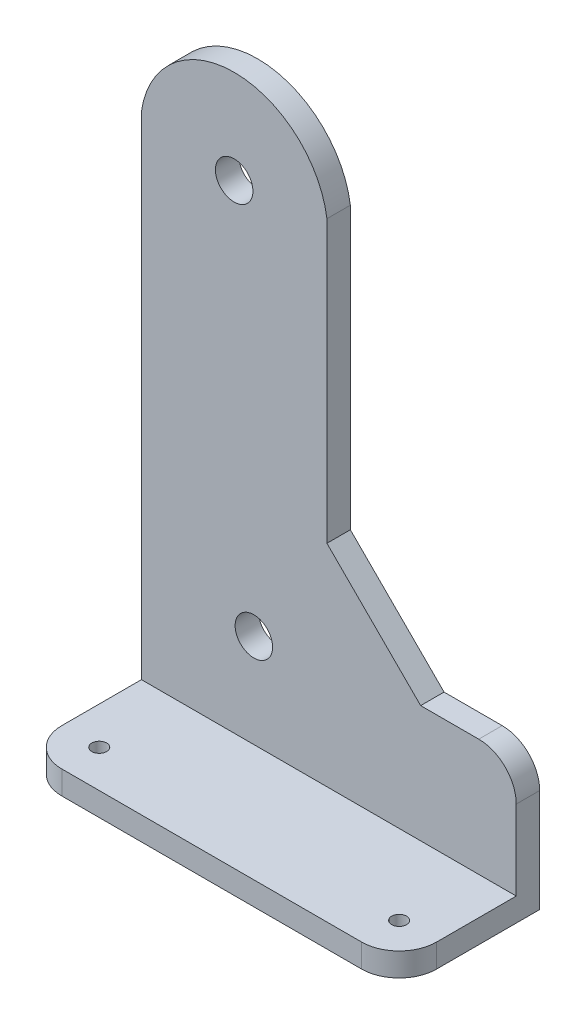
ISO-10303-21;
HEADER;
FILE_DESCRIPTION(('STEP AP214'),'2;1');
FILE_NAME('part.step','',(''),(''),'','','');
FILE_SCHEMA(('AUTOMOTIVE_DESIGN { 1 0 10303 214 1 1 1 1 }'));
ENDSEC;
DATA;
#1=APPLICATION_CONTEXT('core data for automotive mechanical design processes');
#2=APPLICATION_PROTOCOL_DEFINITION('international standard','automotive_design',2000,#1);
#3=PRODUCT_CONTEXT('',#1,'mechanical');
#4=PRODUCT('Part','Part','',(#3));
#5=PRODUCT_RELATED_PRODUCT_CATEGORY('part','',(#4));
#6=PRODUCT_DEFINITION_FORMATION('','',#4);
#7=PRODUCT_DEFINITION_CONTEXT('part definition',#1,'design');
#8=PRODUCT_DEFINITION('design','',#6,#7);
#9=PRODUCT_DEFINITION_SHAPE('','',#8);
#10=(LENGTH_UNIT() NAMED_UNIT(*) SI_UNIT(.MILLI.,.METRE.));
#11=(NAMED_UNIT(*) PLANE_ANGLE_UNIT() SI_UNIT($,.RADIAN.));
#12=(NAMED_UNIT(*) SI_UNIT($,.STERADIAN.) SOLID_ANGLE_UNIT());
#13=UNCERTAINTY_MEASURE_WITH_UNIT(LENGTH_MEASURE(1.E-05),#10,'distance_accuracy_value','');
#14=(GEOMETRIC_REPRESENTATION_CONTEXT(3) GLOBAL_UNCERTAINTY_ASSIGNED_CONTEXT((#13)) GLOBAL_UNIT_ASSIGNED_CONTEXT((#10,
#11,#12)) REPRESENTATION_CONTEXT('',''));
#15=CARTESIAN_POINT('',(0.,0.,0.));
#16=DIRECTION('',(0.,0.,1.));
#17=DIRECTION('',(1.,0.,0.));
#18=AXIS2_PLACEMENT_3D('',#15,#16,#17);
#19=CARTESIAN_POINT('',(-61.550518812335,-258.970259643485,25.));
#20=DIRECTION('',(1.,0.,0.));
#21=DIRECTION('',(0.,1.,0.));
#22=AXIS2_PLACEMENT_3D('',#19,#20,#21);
#23=PLANE('',#22);
#24=DIRECTION('',(0.,1.,0.));
#25=VECTOR('',#24,1.);
#26=CARTESIAN_POINT('',(-61.550518812335,-383.970259643485,110.));
#27=LINE('',#26,#25);
#28=CARTESIAN_POINT('',(-61.550518812335,-258.970259643485,110.));
#29=VERTEX_POINT('',#28);
#30=CARTESIAN_POINT('',(-61.550518812335,-233.970259643485,110.));
#31=VERTEX_POINT('',#30);
#32=EDGE_CURVE('E236',#29,#31,#27,.T.);
#33=ORIENTED_EDGE('',*,*,#32,.T.);
#34=DIRECTION('',(0.,0.,-1.));
#35=VECTOR('',#34,1.);
#36=CARTESIAN_POINT('',(-61.550518812335,-233.970259643485,150.));
#37=LINE('',#36,#35);
#38=CARTESIAN_POINT('',(-61.550518812335,-233.970259643485,25.));
#39=VERTEX_POINT('',#38);
#40=EDGE_CURVE('E149',#31,#39,#37,.T.);
#41=ORIENTED_EDGE('',*,*,#40,.T.);
#42=DIRECTION('',(0.,-1.,0.));
#43=VECTOR('',#42,1.);
#44=CARTESIAN_POINT('',(-61.550518812335,-258.970259643485,25.));
#45=LINE('',#44,#43);
#46=CARTESIAN_POINT('',(-61.550518812335,291.029740356515,25.));
#47=VERTEX_POINT('',#46);
#48=EDGE_CURVE('E168',#47,#39,#45,.T.);
#49=ORIENTED_EDGE('',*,*,#48,.F.);
#50=DIRECTION('',(0.,0.,-1.));
#51=VECTOR('',#50,1.);
#52=CARTESIAN_POINT('',(-61.550518812335,291.029740356515,25.));
#53=LINE('',#52,#51);
#54=CARTESIAN_POINT('',(-61.550518812335,291.029740356515,0.));
#55=VERTEX_POINT('',#54);
#56=EDGE_CURVE('E196',#47,#55,#53,.T.);
#57=ORIENTED_EDGE('',*,*,#56,.T.);
#58=DIRECTION('',(0.,-1.,0.));
#59=VECTOR('',#58,1.);
#60=CARTESIAN_POINT('',(-61.550518812335,-258.970259643485,0.));
#61=LINE('',#60,#59);
#62=CARTESIAN_POINT('',(-61.550518812335,-258.970259643485,0.));
#63=VERTEX_POINT('',#62);
#64=EDGE_CURVE('E183',#55,#63,#61,.T.);
#65=ORIENTED_EDGE('',*,*,#64,.T.);
#66=DIRECTION('',(0.,0.,-1.));
#67=VECTOR('',#66,1.);
#68=CARTESIAN_POINT('',(-61.550518812335,-258.970259643485,25.));
#69=LINE('',#68,#67);
#70=EDGE_CURVE('E194',#29,#63,#69,.T.);
#71=ORIENTED_EDGE('',*,*,#70,.F.);
#72=EDGE_LOOP('',(#33,#41,#49,#57,#65,#71));
#73=FACE_BOUND('',#72,.T.);
#74=ADVANCED_FACE('F37',(#73),#23,.F.);
#75=CARTESIAN_POINT('',(0.,0.,150.));
#76=DIRECTION('',(0.,0.,-1.));
#77=DIRECTION('',(-1.,0.,0.));
#78=AXIS2_PLACEMENT_3D('',#75,#76,#77);
#79=PLANE('',#78);
#80=DIRECTION('',(0.,1.,0.));
#81=VECTOR('',#80,1.);
#82=CARTESIAN_POINT('',(298.449481187665,-383.970259643485,150.));
#83=LINE('',#82,#81);
#84=CARTESIAN_POINT('',(298.449481187665,-233.970259643485,150.));
#85=VERTEX_POINT('',#84);
#86=CARTESIAN_POINT('',(298.449481187665,-258.970259643485,150.));
#87=VERTEX_POINT('',#86);
#88=EDGE_CURVE('E11',#85,#87,#83,.F.);
#89=ORIENTED_EDGE('',*,*,#88,.F.);
#90=DIRECTION('',(-1.,0.,0.));
#91=VECTOR('',#90,1.);
#92=CARTESIAN_POINT('',(-61.550518812335,-233.970259643485,150.));
#93=LINE('',#92,#91);
#94=CARTESIAN_POINT('',(-21.5505188123348,-233.970259643485,150.));
#95=VERTEX_POINT('',#94);
#96=EDGE_CURVE('E141',#85,#95,#93,.T.);
#97=ORIENTED_EDGE('',*,*,#96,.T.);
#98=DIRECTION('',(0.,1.,0.));
#99=VECTOR('',#98,1.);
#100=CARTESIAN_POINT('',(-21.550518812335,-383.970259643485,150.));
#101=LINE('',#100,#99);
#102=CARTESIAN_POINT('',(-21.550518812335,-258.970259643485,150.));
#103=VERTEX_POINT('',#102);
#104=EDGE_CURVE('E46',#95,#103,#101,.F.);
#105=ORIENTED_EDGE('',*,*,#104,.T.);
#106=DIRECTION('',(1.,0.,0.));
#107=VECTOR('',#106,1.);
#108=CARTESIAN_POINT('',(-61.550518812335,-258.970259643485,150.));
#109=LINE('',#108,#107);
#110=EDGE_CURVE('E243',#103,#87,#109,.T.);
#111=ORIENTED_EDGE('',*,*,#110,.T.);
#112=EDGE_LOOP('',(#89,#97,#105,#111));
#113=FACE_BOUND('',#112,.T.);
#114=ADVANCED_FACE('F246',(#113),#79,.F.);
#115=CARTESIAN_POINT('',(298.449481187665,-148.970259643485,25.));
#116=DIRECTION('',(0.,0.,1.));
#117=DIRECTION('',(1.,0.,0.));
#118=AXIS2_PLACEMENT_3D('',#115,#116,#117);
#119=PLANE('',#118);
#120=CARTESIAN_POINT('',(58.449481187665,-133.970259643485,25.));
#121=DIRECTION('',(0.,0.,1.));
#122=DIRECTION('',(1.,0.,0.));
#123=AXIS2_PLACEMENT_3D('',#120,#121,#122);
#124=CIRCLE('',#123,20.);
#125=CARTESIAN_POINT('',(78.449481187665,-133.970259643485,25.));
#126=VERTEX_POINT('',#125);
#127=EDGE_CURVE('E213',#126,#126,#124,.T.);
#128=ORIENTED_EDGE('',*,*,#127,.F.);
#129=EDGE_LOOP('',(#128));
#130=FACE_BOUND('',#129,.T.);
#131=CARTESIAN_POINT('',(37.4392760433285,276.851570007924,25.));
#132=DIRECTION('',(0.,0.,1.));
#133=DIRECTION('',(1.,0.,0.));
#134=AXIS2_PLACEMENT_3D('',#131,#132,#133);
#135=CIRCLE('',#134,20.);
#136=CARTESIAN_POINT('',(57.4392760433285,276.851570007924,25.));
#137=VERTEX_POINT('',#136);
#138=EDGE_CURVE('E219',#137,#137,#135,.T.);
#139=ORIENTED_EDGE('',*,*,#138,.F.);
#140=EDGE_LOOP('',(#139));
#141=FACE_BOUND('',#140,.T.);
#142=ORIENTED_EDGE('',*,*,#48,.T.);
#143=DIRECTION('',(1.,0.,0.));
#144=VECTOR('',#143,1.);
#145=CARTESIAN_POINT('',(298.449481187665,-233.970259643485,25.));
#146=LINE('',#145,#144);
#147=CARTESIAN_POINT('',(338.449481187665,-233.970259643485,25.));
#148=VERTEX_POINT('',#147);
#149=EDGE_CURVE('E148',#39,#148,#146,.T.);
#150=ORIENTED_EDGE('',*,*,#149,.T.);
#151=DIRECTION('',(0.,1.,0.));
#152=VECTOR('',#151,1.);
#153=CARTESIAN_POINT('',(338.449481187665,-258.970259643485,25.));
#154=LINE('',#153,#152);
#155=CARTESIAN_POINT('',(338.449481187665,-148.970259643485,25.));
#156=VERTEX_POINT('',#155);
#157=EDGE_CURVE('E147',#148,#156,#154,.T.);
#158=ORIENTED_EDGE('',*,*,#157,.T.);
#159=CARTESIAN_POINT('',(298.449481187665,-148.970259643485,25.));
#160=DIRECTION('',(0.,0.,1.));
#161=DIRECTION('',(1.,0.,0.));
#162=AXIS2_PLACEMENT_3D('',#159,#160,#161);
#163=CIRCLE('',#162,40.);
#164=CARTESIAN_POINT('',(298.449481187665,-108.970259643485,25.));
#165=VERTEX_POINT('',#164);
#166=EDGE_CURVE('E156',#156,#165,#163,.T.);
#167=ORIENTED_EDGE('',*,*,#166,.T.);
#168=DIRECTION('',(-1.,0.,0.));
#169=VECTOR('',#168,1.);
#170=CARTESIAN_POINT('',(298.449481187665,-108.970259643485,25.));
#171=LINE('',#170,#169);
#172=CARTESIAN_POINT('',(236.429070898992,-108.970259643485,25.));
#173=VERTEX_POINT('',#172);
#174=EDGE_CURVE('E159',#165,#173,#171,.T.);
#175=ORIENTED_EDGE('',*,*,#174,.T.);
#176=DIRECTION('',(-0.707106781186546,0.707106781186549,0.));
#177=VECTOR('',#176,1.);
#178=CARTESIAN_POINT('',(236.429070898992,-108.970259643485,25.));
#179=LINE('',#178,#177);
#180=CARTESIAN_POINT('',(136.429070898992,-8.97025964348497,25.));
#181=VERTEX_POINT('',#180);
#182=EDGE_CURVE('E162',#173,#181,#179,.T.);
#183=ORIENTED_EDGE('',*,*,#182,.T.);
#184=DIRECTION('',(0.,1.,0.));
#185=VECTOR('',#184,1.);
#186=CARTESIAN_POINT('',(136.429070898992,-8.97025964348497,25.));
#187=LINE('',#186,#185);
#188=CARTESIAN_POINT('',(136.429070898992,291.029740356515,25.));
#189=VERTEX_POINT('',#188);
#190=EDGE_CURVE('E164',#181,#189,#187,.T.);
#191=ORIENTED_EDGE('',*,*,#190,.T.);
#192=CARTESIAN_POINT('',(37.4392760433285,276.851570007924,25.));
#193=DIRECTION('',(0.,0.,1.));
#194=DIRECTION('',(-1.,0.,0.));
#195=AXIS2_PLACEMENT_3D('',#192,#193,#194);
#196=CIRCLE('',#195,100.);
#197=EDGE_CURVE('E166',#189,#47,#196,.T.);
#198=ORIENTED_EDGE('',*,*,#197,.T.);
#199=EDGE_LOOP('',(#142,#150,#158,#167,#175,#183,#191,#198));
#200=FACE_BOUND('',#199,.T.);
#201=ADVANCED_FACE('F265',(#130,#141,#200),#119,.T.);
#202=CARTESIAN_POINT('',(298.449481187665,-148.970259643485,25.));
#203=DIRECTION('',(0.,0.,-1.));
#204=DIRECTION('',(-1.,0.,0.));
#205=AXIS2_PLACEMENT_3D('',#202,#203,#204);
#206=CYLINDRICAL_SURFACE('',#205,40.);
#207=CARTESIAN_POINT('',(298.449481187665,-148.970259643485,0.));
#208=DIRECTION('',(0.,0.,1.));
#209=DIRECTION('',(1.,0.,0.));
#210=AXIS2_PLACEMENT_3D('',#207,#208,#209);
#211=CIRCLE('',#210,40.);
#212=CARTESIAN_POINT('',(338.449481187665,-148.970259643485,0.));
#213=VERTEX_POINT('',#212);
#214=CARTESIAN_POINT('',(298.449481187665,-108.970259643485,0.));
#215=VERTEX_POINT('',#214);
#216=EDGE_CURVE('E151',#213,#215,#211,.T.);
#217=ORIENTED_EDGE('',*,*,#216,.T.);
#218=DIRECTION('',(0.,0.,-1.));
#219=VECTOR('',#218,1.);
#220=CARTESIAN_POINT('',(298.449481187665,-108.970259643485,25.));
#221=LINE('',#220,#219);
#222=EDGE_CURVE('E208',#165,#215,#221,.T.);
#223=ORIENTED_EDGE('',*,*,#222,.F.);
#224=ORIENTED_EDGE('',*,*,#166,.F.);
#225=DIRECTION('',(0.,0.,-1.));
#226=VECTOR('',#225,1.);
#227=CARTESIAN_POINT('',(338.449481187665,-148.970259643485,25.));
#228=LINE('',#227,#226);
#229=EDGE_CURVE('E172',#156,#213,#228,.T.);
#230=ORIENTED_EDGE('',*,*,#229,.T.);
#231=EDGE_LOOP('',(#217,#223,#224,#230));
#232=FACE_BOUND('',#231,.T.);
#233=ADVANCED_FACE('F39',(#232),#206,.T.);
#234=CARTESIAN_POINT('',(298.449481187665,-108.970259643485,25.));
#235=DIRECTION('',(0.,-1.,0.));
#236=DIRECTION('',(0.,0.,-1.));
#237=AXIS2_PLACEMENT_3D('',#234,#235,#236);
#238=PLANE('',#237);
#239=DIRECTION('',(-1.,0.,0.));
#240=VECTOR('',#239,1.);
#241=CARTESIAN_POINT('',(298.449481187665,-108.970259643485,0.));
#242=LINE('',#241,#240);
#243=CARTESIAN_POINT('',(236.429070898992,-108.970259643485,0.));
#244=VERTEX_POINT('',#243);
#245=EDGE_CURVE('E175',#215,#244,#242,.T.);
#246=ORIENTED_EDGE('',*,*,#245,.T.);
#247=DIRECTION('',(0.,0.,-1.));
#248=VECTOR('',#247,1.);
#249=CARTESIAN_POINT('',(236.429070898992,-108.970259643485,25.));
#250=LINE('',#249,#248);
#251=EDGE_CURVE('E205',#173,#244,#250,.T.);
#252=ORIENTED_EDGE('',*,*,#251,.F.);
#253=ORIENTED_EDGE('',*,*,#174,.F.);
#254=ORIENTED_EDGE('',*,*,#222,.T.);
#255=EDGE_LOOP('',(#246,#252,#253,#254));
#256=FACE_BOUND('',#255,.T.);
#257=ADVANCED_FACE('F262',(#256),#238,.F.);
#258=CARTESIAN_POINT('',(236.429070898992,-108.970259643485,25.));
#259=DIRECTION('',(-0.707106781186549,-0.707106781186546,0.));
#260=DIRECTION('',(0.707106781186546,-0.707106781186549,0.));
#261=AXIS2_PLACEMENT_3D('',#258,#259,#260);
#262=PLANE('',#261);
#263=DIRECTION('',(-0.707106781186546,0.707106781186549,0.));
#264=VECTOR('',#263,1.);
#265=CARTESIAN_POINT('',(236.429070898992,-108.970259643485,0.));
#266=LINE('',#265,#264);
#267=CARTESIAN_POINT('',(136.429070898992,-8.97025964348497,0.));
#268=VERTEX_POINT('',#267);
#269=EDGE_CURVE('E177',#244,#268,#266,.T.);
#270=ORIENTED_EDGE('',*,*,#269,.T.);
#271=DIRECTION('',(0.,0.,-1.));
#272=VECTOR('',#271,1.);
#273=CARTESIAN_POINT('',(136.429070898992,-8.97025964348497,25.));
#274=LINE('',#273,#272);
#275=EDGE_CURVE('E202',#181,#268,#274,.T.);
#276=ORIENTED_EDGE('',*,*,#275,.F.);
#277=ORIENTED_EDGE('',*,*,#182,.F.);
#278=ORIENTED_EDGE('',*,*,#251,.T.);
#279=EDGE_LOOP('',(#270,#276,#277,#278));
#280=FACE_BOUND('',#279,.T.);
#281=ADVANCED_FACE('F283',(#280),#262,.F.);
#282=CARTESIAN_POINT('',(136.429070898992,-8.97025964348497,25.));
#283=DIRECTION('',(-1.,0.,0.));
#284=DIRECTION('',(0.,0.,1.));
#285=AXIS2_PLACEMENT_3D('',#282,#283,#284);
#286=PLANE('',#285);
#287=DIRECTION('',(0.,1.,0.));
#288=VECTOR('',#287,1.);
#289=CARTESIAN_POINT('',(136.429070898992,-8.97025964348497,0.));
#290=LINE('',#289,#288);
#291=CARTESIAN_POINT('',(136.429070898992,291.029740356515,0.));
#292=VERTEX_POINT('',#291);
#293=EDGE_CURVE('E179',#268,#292,#290,.T.);
#294=ORIENTED_EDGE('',*,*,#293,.T.);
#295=DIRECTION('',(0.,0.,-1.));
#296=VECTOR('',#295,1.);
#297=CARTESIAN_POINT('',(136.429070898992,291.029740356515,25.));
#298=LINE('',#297,#296);
#299=EDGE_CURVE('E199',#189,#292,#298,.T.);
#300=ORIENTED_EDGE('',*,*,#299,.F.);
#301=ORIENTED_EDGE('',*,*,#190,.F.);
#302=ORIENTED_EDGE('',*,*,#275,.T.);
#303=EDGE_LOOP('',(#294,#300,#301,#302));
#304=FACE_BOUND('',#303,.T.);
#305=ADVANCED_FACE('F280',(#304),#286,.F.);
#306=CARTESIAN_POINT('',(37.4392760433285,276.851570007924,25.));
#307=DIRECTION('',(0.,0.,-1.));
#308=DIRECTION('',(-1.,0.,0.));
#309=AXIS2_PLACEMENT_3D('',#306,#307,#308);
#310=CYLINDRICAL_SURFACE('',#309,100.);
#311=CARTESIAN_POINT('',(37.4392760433285,276.851570007924,0.));
#312=DIRECTION('',(0.,0.,1.));
#313=DIRECTION('',(-1.,0.,0.));
#314=AXIS2_PLACEMENT_3D('',#311,#312,#313);
#315=CIRCLE('',#314,100.);
#316=EDGE_CURVE('E181',#292,#55,#315,.T.);
#317=ORIENTED_EDGE('',*,*,#316,.T.);
#318=ORIENTED_EDGE('',*,*,#56,.F.);
#319=ORIENTED_EDGE('',*,*,#197,.F.);
#320=ORIENTED_EDGE('',*,*,#299,.T.);
#321=EDGE_LOOP('',(#317,#318,#319,#320));
#322=FACE_BOUND('',#321,.T.);
#323=ADVANCED_FACE('F275',(#322),#310,.T.);
#324=CARTESIAN_POINT('',(-61.550518812335,-258.970259643485,25.));
#325=DIRECTION('',(0.,1.,0.));
#326=DIRECTION('',(0.,0.,1.));
#327=AXIS2_PLACEMENT_3D('',#324,#325,#326);
#328=PLANE('',#327);
#329=CARTESIAN_POINT('',(-21.550518812335,-258.970259643485,110.));
#330=DIRECTION('',(0.,1.,0.));
#331=DIRECTION('',(0.,0.,1.));
#332=AXIS2_PLACEMENT_3D('',#329,#330,#331);
#333=CIRCLE('',#332,7.94);
#334=CARTESIAN_POINT('',(-21.550518812335,-258.970259643485,117.94));
#335=VERTEX_POINT('',#334);
#336=EDGE_CURVE('E234',#335,#335,#333,.T.);
#337=ORIENTED_EDGE('',*,*,#336,.T.);
#338=EDGE_LOOP('',(#337));
#339=FACE_BOUND('',#338,.T.);
#340=CARTESIAN_POINT('',(298.449481187665,-258.970259643485,110.));
#341=DIRECTION('',(0.,1.,0.));
#342=DIRECTION('',(0.,0.,1.));
#343=AXIS2_PLACEMENT_3D('',#340,#341,#342);
#344=CIRCLE('',#343,7.93999999999998);
#345=CARTESIAN_POINT('',(298.449481187665,-258.970259643485,117.94));
#346=VERTEX_POINT('',#345);
#347=EDGE_CURVE('E229',#346,#346,#344,.T.);
#348=ORIENTED_EDGE('',*,*,#347,.T.);
#349=EDGE_LOOP('',(#348));
#350=FACE_BOUND('',#349,.T.);
#351=DIRECTION('',(0.,0.,-1.));
#352=VECTOR('',#351,1.);
#353=CARTESIAN_POINT('',(338.449481187665,-258.970259643485,25.));
#354=LINE('',#353,#352);
#355=CARTESIAN_POINT('',(338.449481187665,-258.970259643485,110.));
#356=VERTEX_POINT('',#355);
#357=CARTESIAN_POINT('',(338.449481187665,-258.970259643485,0.));
#358=VERTEX_POINT('',#357);
#359=EDGE_CURVE('E192',#356,#358,#354,.T.);
#360=ORIENTED_EDGE('',*,*,#359,.F.);
#361=CARTESIAN_POINT('',(298.449481187665,-258.970259643485,110.));
#362=DIRECTION('',(0.,1.,0.));
#363=DIRECTION('',(0.,0.,1.));
#364=AXIS2_PLACEMENT_3D('',#361,#362,#363);
#365=CIRCLE('',#364,40.);
#366=EDGE_CURVE('E128',#356,#87,#365,.F.);
#367=ORIENTED_EDGE('',*,*,#366,.T.);
#368=ORIENTED_EDGE('',*,*,#110,.F.);
#369=CARTESIAN_POINT('',(-21.550518812335,-258.970259643485,110.));
#370=DIRECTION('',(0.,1.,0.));
#371=DIRECTION('',(0.,0.,1.));
#372=AXIS2_PLACEMENT_3D('',#369,#370,#371);
#373=CIRCLE('',#372,40.);
#374=EDGE_CURVE('E61',#103,#29,#373,.F.);
#375=ORIENTED_EDGE('',*,*,#374,.T.);
#376=ORIENTED_EDGE('',*,*,#70,.T.);
#377=DIRECTION('',(1.,0.,0.));
#378=VECTOR('',#377,1.);
#379=CARTESIAN_POINT('',(-61.550518812335,-258.970259643485,0.));
#380=LINE('',#379,#378);
#381=EDGE_CURVE('E186',#63,#358,#380,.T.);
#382=ORIENTED_EDGE('',*,*,#381,.T.);
#383=EDGE_LOOP('',(#360,#367,#368,#375,#376,#382));
#384=FACE_BOUND('',#383,.T.);
#385=ADVANCED_FACE('F249',(#339,#350,#384),#328,.F.);
#386=CARTESIAN_POINT('',(338.449481187665,-258.970259643485,25.));
#387=DIRECTION('',(-1.,0.,0.));
#388=DIRECTION('',(0.,-1.,0.));
#389=AXIS2_PLACEMENT_3D('',#386,#387,#388);
#390=PLANE('',#389);
#391=DIRECTION('',(0.,0.,-1.));
#392=VECTOR('',#391,1.);
#393=CARTESIAN_POINT('',(338.449481187665,-233.970259643485,150.));
#394=LINE('',#393,#392);
#395=CARTESIAN_POINT('',(338.449481187665,-233.970259643485,110.));
#396=VERTEX_POINT('',#395);
#397=EDGE_CURVE('E137',#396,#148,#394,.T.);
#398=ORIENTED_EDGE('',*,*,#397,.F.);
#399=DIRECTION('',(0.,1.,0.));
#400=VECTOR('',#399,1.);
#401=CARTESIAN_POINT('',(338.449481187665,-383.970259643485,110.));
#402=LINE('',#401,#400);
#403=EDGE_CURVE('E125',#356,#396,#402,.T.);
#404=ORIENTED_EDGE('',*,*,#403,.F.);
#405=ORIENTED_EDGE('',*,*,#359,.T.);
#406=DIRECTION('',(0.,1.,0.));
#407=VECTOR('',#406,1.);
#408=CARTESIAN_POINT('',(338.449481187665,-258.970259643485,0.));
#409=LINE('',#408,#407);
#410=EDGE_CURVE('E160',#358,#213,#409,.T.);
#411=ORIENTED_EDGE('',*,*,#410,.T.);
#412=ORIENTED_EDGE('',*,*,#229,.F.);
#413=ORIENTED_EDGE('',*,*,#157,.F.);
#414=EDGE_LOOP('',(#398,#404,#405,#411,#412,#413));
#415=FACE_BOUND('',#414,.T.);
#416=ADVANCED_FACE('F145',(#415),#390,.F.);
#417=CARTESIAN_POINT('',(298.449481187665,-148.970259643485,0.));
#418=DIRECTION('',(0.,0.,1.));
#419=DIRECTION('',(1.,0.,0.));
#420=AXIS2_PLACEMENT_3D('',#417,#418,#419);
#421=PLANE('',#420);
#422=CARTESIAN_POINT('',(58.449481187665,-133.970259643485,0.));
#423=DIRECTION('',(0.,0.,1.));
#424=DIRECTION('',(1.,0.,0.));
#425=AXIS2_PLACEMENT_3D('',#422,#423,#424);
#426=CIRCLE('',#425,20.);
#427=CARTESIAN_POINT('',(78.449481187665,-133.970259643485,0.));
#428=VERTEX_POINT('',#427);
#429=EDGE_CURVE('E41',#428,#428,#426,.T.);
#430=ORIENTED_EDGE('',*,*,#429,.T.);
#431=EDGE_LOOP('',(#430));
#432=FACE_BOUND('',#431,.T.);
#433=CARTESIAN_POINT('',(37.4392760433285,276.851570007924,0.));
#434=DIRECTION('',(0.,0.,1.));
#435=DIRECTION('',(1.,0.,0.));
#436=AXIS2_PLACEMENT_3D('',#433,#434,#435);
#437=CIRCLE('',#436,20.);
#438=CARTESIAN_POINT('',(57.4392760433285,276.851570007924,0.));
#439=VERTEX_POINT('',#438);
#440=EDGE_CURVE('E211',#439,#439,#437,.T.);
#441=ORIENTED_EDGE('',*,*,#440,.T.);
#442=EDGE_LOOP('',(#441));
#443=FACE_BOUND('',#442,.T.);
#444=ORIENTED_EDGE('',*,*,#381,.F.);
#445=ORIENTED_EDGE('',*,*,#64,.F.);
#446=ORIENTED_EDGE('',*,*,#316,.F.);
#447=ORIENTED_EDGE('',*,*,#293,.F.);
#448=ORIENTED_EDGE('',*,*,#269,.F.);
#449=ORIENTED_EDGE('',*,*,#245,.F.);
#450=ORIENTED_EDGE('',*,*,#216,.F.);
#451=ORIENTED_EDGE('',*,*,#410,.F.);
#452=EDGE_LOOP('',(#444,#445,#446,#447,#448,#449,#450,#451));
#453=FACE_BOUND('',#452,.T.);
#454=ADVANCED_FACE('F257',(#432,#443,#453),#421,.F.);
#455=CARTESIAN_POINT('',(-61.550518812335,-233.970259643485,150.));
#456=DIRECTION('',(0.,-1.,0.));
#457=DIRECTION('',(0.,0.,-1.));
#458=AXIS2_PLACEMENT_3D('',#455,#456,#457);
#459=PLANE('',#458);
#460=CARTESIAN_POINT('',(-21.550518812335,-233.970259643485,110.));
#461=DIRECTION('',(0.,1.,0.));
#462=DIRECTION('',(0.,0.,1.));
#463=AXIS2_PLACEMENT_3D('',#460,#461,#462);
#464=CIRCLE('',#463,7.94);
#465=CARTESIAN_POINT('',(-21.550518812335,-233.970259643485,117.94));
#466=VERTEX_POINT('',#465);
#467=EDGE_CURVE('E226',#466,#466,#464,.T.);
#468=ORIENTED_EDGE('',*,*,#467,.F.);
#469=EDGE_LOOP('',(#468));
#470=FACE_BOUND('',#469,.T.);
#471=CARTESIAN_POINT('',(298.449481187665,-233.970259643485,110.));
#472=DIRECTION('',(0.,1.,0.));
#473=DIRECTION('',(0.,0.,1.));
#474=AXIS2_PLACEMENT_3D('',#471,#472,#473);
#475=CIRCLE('',#474,7.93999999999998);
#476=CARTESIAN_POINT('',(298.449481187665,-233.970259643485,117.94));
#477=VERTEX_POINT('',#476);
#478=EDGE_CURVE('E217',#477,#477,#475,.T.);
#479=ORIENTED_EDGE('',*,*,#478,.F.);
#480=EDGE_LOOP('',(#479));
#481=FACE_BOUND('',#480,.T.);
#482=ORIENTED_EDGE('',*,*,#96,.F.);
#483=CARTESIAN_POINT('',(298.449481187665,-233.970259643485,110.));
#484=DIRECTION('',(0.,-1.,0.));
#485=DIRECTION('',(0.,0.,-1.));
#486=AXIS2_PLACEMENT_3D('',#483,#484,#485);
#487=CIRCLE('',#486,40.);
#488=EDGE_CURVE('E53',#396,#85,#487,.T.);
#489=ORIENTED_EDGE('',*,*,#488,.F.);
#490=ORIENTED_EDGE('',*,*,#397,.T.);
#491=ORIENTED_EDGE('',*,*,#149,.F.);
#492=ORIENTED_EDGE('',*,*,#40,.F.);
#493=CARTESIAN_POINT('',(-21.550518812335,-233.970259643485,110.));
#494=DIRECTION('',(0.,-1.,0.));
#495=DIRECTION('',(0.,0.,1.));
#496=AXIS2_PLACEMENT_3D('',#493,#494,#495);
#497=CIRCLE('',#496,40.);
#498=EDGE_CURVE('E142',#95,#31,#497,.T.);
#499=ORIENTED_EDGE('',*,*,#498,.F.);
#500=EDGE_LOOP('',(#482,#489,#490,#491,#492,#499));
#501=FACE_BOUND('',#500,.T.);
#502=ADVANCED_FACE('F135',(#470,#481,#501),#459,.F.);
#503=CARTESIAN_POINT('',(-21.550518812335,-383.970259643485,110.));
#504=DIRECTION('',(0.,1.,0.));
#505=DIRECTION('',(0.,0.,1.));
#506=AXIS2_PLACEMENT_3D('',#503,#504,#505);
#507=CYLINDRICAL_SURFACE('',#506,40.);
#508=ORIENTED_EDGE('',*,*,#104,.F.);
#509=ORIENTED_EDGE('',*,*,#498,.T.);
#510=ORIENTED_EDGE('',*,*,#32,.F.);
#511=ORIENTED_EDGE('',*,*,#374,.F.);
#512=EDGE_LOOP('',(#508,#509,#510,#511));
#513=FACE_BOUND('',#512,.T.);
#514=ADVANCED_FACE('F270',(#513),#507,.T.);
#515=CARTESIAN_POINT('',(298.449481187665,-383.970259643485,110.));
#516=DIRECTION('',(0.,1.,0.));
#517=DIRECTION('',(0.,0.,1.));
#518=AXIS2_PLACEMENT_3D('',#515,#516,#517);
#519=CYLINDRICAL_SURFACE('',#518,40.);
#520=ORIENTED_EDGE('',*,*,#403,.T.);
#521=ORIENTED_EDGE('',*,*,#488,.T.);
#522=ORIENTED_EDGE('',*,*,#88,.T.);
#523=ORIENTED_EDGE('',*,*,#366,.F.);
#524=EDGE_LOOP('',(#520,#521,#522,#523));
#525=FACE_BOUND('',#524,.T.);
#526=ADVANCED_FACE('F126',(#525),#519,.T.);
#527=CARTESIAN_POINT('',(298.449481187665,-383.970259643485,110.));
#528=DIRECTION('',(0.,1.,0.));
#529=DIRECTION('',(0.,0.,1.));
#530=AXIS2_PLACEMENT_3D('',#527,#528,#529);
#531=CYLINDRICAL_SURFACE('',#530,7.93999999999998);
#532=ORIENTED_EDGE('',*,*,#478,.T.);
#533=EDGE_LOOP('',(#532));
#534=FACE_BOUND('',#533,.T.);
#535=ORIENTED_EDGE('',*,*,#347,.F.);
#536=EDGE_LOOP('',(#535));
#537=FACE_BOUND('',#536,.T.);
#538=ADVANCED_FACE('F312',(#534,#537),#531,.F.);
#539=CARTESIAN_POINT('',(-21.550518812335,-383.970259643485,110.));
#540=DIRECTION('',(0.,1.,0.));
#541=DIRECTION('',(0.,0.,1.));
#542=AXIS2_PLACEMENT_3D('',#539,#540,#541);
#543=CYLINDRICAL_SURFACE('',#542,7.94);
#544=ORIENTED_EDGE('',*,*,#467,.T.);
#545=EDGE_LOOP('',(#544));
#546=FACE_BOUND('',#545,.T.);
#547=ORIENTED_EDGE('',*,*,#336,.F.);
#548=EDGE_LOOP('',(#547));
#549=FACE_BOUND('',#548,.T.);
#550=ADVANCED_FACE('F314',(#546,#549),#543,.F.);
#551=CARTESIAN_POINT('',(37.4392760433285,276.851570007924,-125.));
#552=DIRECTION('',(0.,0.,1.));
#553=DIRECTION('',(1.,0.,0.));
#554=AXIS2_PLACEMENT_3D('',#551,#552,#553);
#555=CYLINDRICAL_SURFACE('',#554,20.);
#556=ORIENTED_EDGE('',*,*,#138,.T.);
#557=EDGE_LOOP('',(#556));
#558=FACE_BOUND('',#557,.T.);
#559=ORIENTED_EDGE('',*,*,#440,.F.);
#560=EDGE_LOOP('',(#559));
#561=FACE_BOUND('',#560,.T.);
#562=ADVANCED_FACE('F321',(#558,#561),#555,.F.);
#563=CARTESIAN_POINT('',(58.449481187665,-133.970259643485,-125.));
#564=DIRECTION('',(0.,0.,1.));
#565=DIRECTION('',(1.,0.,0.));
#566=AXIS2_PLACEMENT_3D('',#563,#564,#565);
#567=CYLINDRICAL_SURFACE('',#566,20.);
#568=ORIENTED_EDGE('',*,*,#127,.T.);
#569=EDGE_LOOP('',(#568));
#570=FACE_BOUND('',#569,.T.);
#571=ORIENTED_EDGE('',*,*,#429,.F.);
#572=EDGE_LOOP('',(#571));
#573=FACE_BOUND('',#572,.T.);
#574=ADVANCED_FACE('F341',(#570,#573),#567,.F.);
#575=CLOSED_SHELL('',(#74,#114,#201,#233,#257,#281,#305,#323,#385,#416,#454,#502,#514,#526,#538,
#550,#562,#574));
#576=MANIFOLD_SOLID_BREP('B2',#575);
#577=ADVANCED_BREP_SHAPE_REPRESENTATION('',(#18,#576),#14);
#578=SHAPE_DEFINITION_REPRESENTATION(#9,#577);
ENDSEC;
END-ISO-10303-21;
